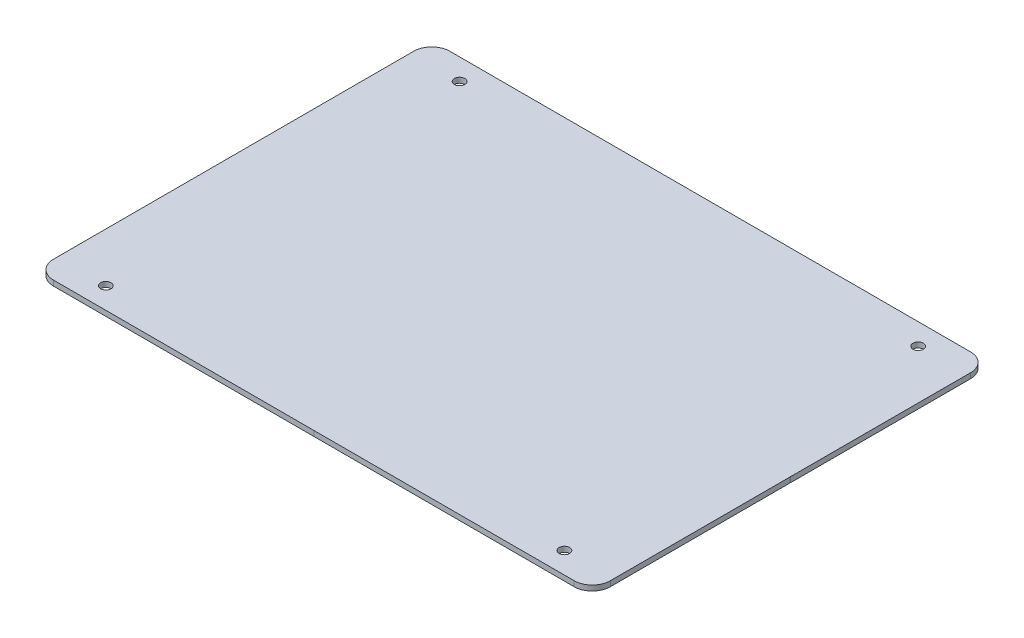
ISO-10303-21;
HEADER;
FILE_DESCRIPTION(('STEP AP214'),'2;1');
FILE_NAME('part.step','',(''),(''),'','','');
FILE_SCHEMA(('AUTOMOTIVE_DESIGN { 1 0 10303 214 1 1 1 1 }'));
ENDSEC;
DATA;
#1=APPLICATION_CONTEXT('core data for automotive mechanical design processes');
#2=APPLICATION_PROTOCOL_DEFINITION('international standard','automotive_design',2000,#1);
#3=PRODUCT_CONTEXT('',#1,'mechanical');
#4=PRODUCT('Part','Part','',(#3));
#5=PRODUCT_RELATED_PRODUCT_CATEGORY('part','',(#4));
#6=PRODUCT_DEFINITION_FORMATION('','',#4);
#7=PRODUCT_DEFINITION_CONTEXT('part definition',#1,'design');
#8=PRODUCT_DEFINITION('design','',#6,#7);
#9=PRODUCT_DEFINITION_SHAPE('','',#8);
#10=(LENGTH_UNIT() NAMED_UNIT(*) SI_UNIT(.MILLI.,.METRE.));
#11=(NAMED_UNIT(*) PLANE_ANGLE_UNIT() SI_UNIT($,.RADIAN.));
#12=(NAMED_UNIT(*) SI_UNIT($,.STERADIAN.) SOLID_ANGLE_UNIT());
#13=UNCERTAINTY_MEASURE_WITH_UNIT(LENGTH_MEASURE(1.E-05),#10,'distance_accuracy_value','');
#14=(GEOMETRIC_REPRESENTATION_CONTEXT(3) GLOBAL_UNCERTAINTY_ASSIGNED_CONTEXT((#13)) GLOBAL_UNIT_ASSIGNED_CONTEXT((#10,
#11,#12)) REPRESENTATION_CONTEXT('',''));
#15=CARTESIAN_POINT('',(0.,0.,0.));
#16=DIRECTION('',(0.,0.,1.));
#17=DIRECTION('',(1.,0.,0.));
#18=AXIS2_PLACEMENT_3D('',#15,#16,#17);
#19=CARTESIAN_POINT('',(-85.0000014499987,1.6,0.));
#20=DIRECTION('',(1.,0.,0.));
#21=DIRECTION('',(0.,0.,-1.));
#22=AXIS2_PLACEMENT_3D('',#19,#20,#21);
#23=PLANE('',#22);
#24=DIRECTION('',(0.,0.,1.));
#25=VECTOR('',#24,1.);
#26=CARTESIAN_POINT('',(-85.0000014499987,0.,0.));
#27=LINE('',#26,#25);
#28=CARTESIAN_POINT('',(-85.0000014499987,0.,-54.9999976960012));
#29=VERTEX_POINT('',#28);
#30=CARTESIAN_POINT('',(-85.0000014499987,0.,54.9999992834999));
#31=VERTEX_POINT('',#30);
#32=EDGE_CURVE('E166',#29,#31,#27,.T.);
#33=ORIENTED_EDGE('',*,*,#32,.T.);
#34=DIRECTION('',(0.,-1.,0.));
#35=VECTOR('',#34,1.);
#36=CARTESIAN_POINT('',(-85.0000014499987,1.6,54.9999992834999));
#37=LINE('',#36,#35);
#38=CARTESIAN_POINT('',(-85.0000014499987,1.6,54.9999992834999));
#39=VERTEX_POINT('',#38);
#40=EDGE_CURVE('E11',#39,#31,#37,.T.);
#41=ORIENTED_EDGE('',*,*,#40,.F.);
#42=DIRECTION('',(0.,0.,1.));
#43=VECTOR('',#42,1.);
#44=CARTESIAN_POINT('',(-85.0000014499987,1.6,0.));
#45=LINE('',#44,#43);
#46=CARTESIAN_POINT('',(-85.0000014499987,1.6,-54.9999976960012));
#47=VERTEX_POINT('',#46);
#48=EDGE_CURVE('E257',#47,#39,#45,.T.);
#49=ORIENTED_EDGE('',*,*,#48,.F.);
#50=DIRECTION('',(0.,-1.,0.));
#51=VECTOR('',#50,1.);
#52=CARTESIAN_POINT('',(-85.0000014499987,1.6,-54.9999976960012));
#53=LINE('',#52,#51);
#54=EDGE_CURVE('E150',#47,#29,#53,.T.);
#55=ORIENTED_EDGE('',*,*,#54,.T.);
#56=EDGE_LOOP('',(#33,#41,#49,#55));
#57=FACE_BOUND('',#56,.T.);
#58=ADVANCED_FACE('F35',(#57),#23,.F.);
#59=CARTESIAN_POINT('',(-79.5000048299987,1.6,54.9999992834999));
#60=DIRECTION('',(0.,-1.,0.));
#61=DIRECTION('',(0.,0.,-1.));
#62=AXIS2_PLACEMENT_3D('',#59,#60,#61);
#63=CYLINDRICAL_SURFACE('',#62,5.49999661999999);
#64=CARTESIAN_POINT('',(-79.5000048299987,0.,54.9999992834999));
#65=DIRECTION('',(0.,1.,0.));
#66=DIRECTION('',(0.,0.,1.));
#67=AXIS2_PLACEMENT_3D('',#64,#65,#66);
#68=CIRCLE('',#67,5.49999661999999);
#69=CARTESIAN_POINT('',(-79.5000054206681,0.,60.4999959034999));
#70=VERTEX_POINT('',#69);
#71=EDGE_CURVE('E169',#31,#70,#68,.T.);
#72=ORIENTED_EDGE('',*,*,#71,.T.);
#73=DIRECTION('',(0.,-1.,0.));
#74=VECTOR('',#73,1.);
#75=CARTESIAN_POINT('',(-79.5000054206681,1.6,60.4999959034999));
#76=LINE('',#75,#74);
#77=CARTESIAN_POINT('',(-79.5000054206681,1.6,60.4999959034999));
#78=VERTEX_POINT('',#77);
#79=EDGE_CURVE('E44',#78,#70,#76,.T.);
#80=ORIENTED_EDGE('',*,*,#79,.F.);
#81=CARTESIAN_POINT('',(-79.5000048299987,1.6,54.9999992834999));
#82=DIRECTION('',(0.,1.,0.));
#83=DIRECTION('',(0.,0.,1.));
#84=AXIS2_PLACEMENT_3D('',#81,#82,#83);
#85=CIRCLE('',#84,5.49999661999999);
#86=EDGE_CURVE('E103',#39,#78,#85,.T.);
#87=ORIENTED_EDGE('',*,*,#86,.F.);
#88=ORIENTED_EDGE('',*,*,#40,.T.);
#89=EDGE_LOOP('',(#72,#80,#87,#88));
#90=FACE_BOUND('',#89,.T.);
#91=ADVANCED_FACE('F272',(#90),#63,.T.);
#92=CARTESIAN_POINT('',(-6.49736788462269E-06,1.6,60.5000044413627));
#93=DIRECTION('',(1.07394502605698E-07,0.,-0.999999999999994));
#94=DIRECTION('',(-0.999999999999994,0.,-1.07394502605698E-07));
#95=AXIS2_PLACEMENT_3D('',#92,#93,#94);
#96=PLANE('',#95);
#97=DIRECTION('',(0.999999999999994,0.,1.07394502605698E-07));
#98=VECTOR('',#97,1.);
#99=CARTESIAN_POINT('',(-6.49736788462269E-06,0.,60.5000044413627));
#100=LINE('',#99,#98);
#101=CARTESIAN_POINT('',(-7.34840897762948E-06,0.,60.5000044413626));
#102=VERTEX_POINT('',#101);
#103=EDGE_CURVE('E171',#70,#102,#100,.T.);
#104=ORIENTED_EDGE('',*,*,#103,.T.);
#105=DIRECTION('',(0.,-1.,0.));
#106=VECTOR('',#105,1.);
#107=CARTESIAN_POINT('',(-7.34840897762948E-06,1.6,60.5000044413626));
#108=LINE('',#107,#106);
#109=CARTESIAN_POINT('',(-7.34840897762948E-06,1.6,60.5000044413626));
#110=VERTEX_POINT('',#109);
#111=EDGE_CURVE('E209',#110,#102,#108,.T.);
#112=ORIENTED_EDGE('',*,*,#111,.F.);
#113=DIRECTION('',(0.999999999999994,0.,1.07394502605698E-07));
#114=VECTOR('',#113,1.);
#115=CARTESIAN_POINT('',(-6.49736788462269E-06,1.6,60.5000044413627));
#116=LINE('',#115,#114);
#117=EDGE_CURVE('E217',#78,#110,#116,.T.);
#118=ORIENTED_EDGE('',*,*,#117,.F.);
#119=ORIENTED_EDGE('',*,*,#79,.T.);
#120=EDGE_LOOP('',(#104,#112,#118,#119));
#121=FACE_BOUND('',#120,.T.);
#122=ADVANCED_FACE('F215',(#121),#96,.F.);
#123=CARTESIAN_POINT('',(5.10036867085493E-06,1.6,60.5000044413616));
#124=DIRECTION('',(-8.43036082054894E-08,0.,-0.999999999999997));
#125=DIRECTION('',(-0.999999999999997,0.,8.43036082054894E-08));
#126=AXIS2_PLACEMENT_3D('',#123,#124,#125);
#127=PLANE('',#126);
#128=DIRECTION('',(0.999999999999996,0.,-8.43036082054894E-08));
#129=VECTOR('',#128,1.);
#130=CARTESIAN_POINT('',(5.10036867085493E-06,0.,60.5000044413616));
#131=LINE('',#130,#129);
#132=CARTESIAN_POINT('',(79.499997673671,0.,60.4999977392253));
#133=VERTEX_POINT('',#132);
#134=EDGE_CURVE('E173',#102,#133,#131,.T.);
#135=ORIENTED_EDGE('',*,*,#134,.T.);
#136=DIRECTION('',(0.,-1.,0.));
#137=VECTOR('',#136,1.);
#138=CARTESIAN_POINT('',(79.499997673671,1.6,60.4999977392253));
#139=LINE('',#138,#137);
#140=CARTESIAN_POINT('',(79.499997673671,1.6,60.4999977392253));
#141=VERTEX_POINT('',#140);
#142=EDGE_CURVE('E206',#141,#133,#139,.T.);
#143=ORIENTED_EDGE('',*,*,#142,.F.);
#144=DIRECTION('',(0.999999999999996,0.,-8.43036082054894E-08));
#145=VECTOR('',#144,1.);
#146=CARTESIAN_POINT('',(5.10036867085493E-06,1.6,60.5000044413616));
#147=LINE('',#146,#145);
#148=EDGE_CURVE('E235',#110,#141,#147,.T.);
#149=ORIENTED_EDGE('',*,*,#148,.F.);
#150=ORIENTED_EDGE('',*,*,#111,.T.);
#151=EDGE_LOOP('',(#135,#143,#149,#150));
#152=FACE_BOUND('',#151,.T.);
#153=ADVANCED_FACE('F225',(#152),#127,.F.);
#154=CARTESIAN_POINT('',(79.4999972100013,1.6,54.9999998492254));
#155=DIRECTION('',(0.,-1.,0.));
#156=DIRECTION('',(0.,0.,-1.));
#157=AXIS2_PLACEMENT_3D('',#154,#155,#156);
#158=CYLINDRICAL_SURFACE('',#157,5.49999788999998);
#159=CARTESIAN_POINT('',(79.4999972100013,0.,54.9999998492254));
#160=DIRECTION('',(0.,1.,0.));
#161=DIRECTION('',(0.,0.,1.));
#162=AXIS2_PLACEMENT_3D('',#159,#160,#161);
#163=CIRCLE('',#162,5.49999788999998);
#164=CARTESIAN_POINT('',(84.9999951000013,0.,54.9999996587254));
#165=VERTEX_POINT('',#164);
#166=EDGE_CURVE('E175',#133,#165,#163,.T.);
#167=ORIENTED_EDGE('',*,*,#166,.T.);
#168=DIRECTION('',(0.,-1.,0.));
#169=VECTOR('',#168,1.);
#170=CARTESIAN_POINT('',(84.9999951000013,1.6,54.9999996587254));
#171=LINE('',#170,#169);
#172=CARTESIAN_POINT('',(84.9999951000013,1.6,54.9999996587254));
#173=VERTEX_POINT('',#172);
#174=EDGE_CURVE('E204',#173,#165,#171,.T.);
#175=ORIENTED_EDGE('',*,*,#174,.F.);
#176=CARTESIAN_POINT('',(79.4999972100013,1.6,54.9999998492254));
#177=DIRECTION('',(0.,1.,0.));
#178=DIRECTION('',(0.,0.,1.));
#179=AXIS2_PLACEMENT_3D('',#176,#177,#178);
#180=CIRCLE('',#179,5.49999788999998);
#181=EDGE_CURVE('E231',#141,#173,#180,.T.);
#182=ORIENTED_EDGE('',*,*,#181,.F.);
#183=ORIENTED_EDGE('',*,*,#142,.T.);
#184=EDGE_LOOP('',(#167,#175,#182,#183));
#185=FACE_BOUND('',#184,.T.);
#186=ADVANCED_FACE('F229',(#185),#158,.T.);
#187=CARTESIAN_POINT('',(84.9999931949999,1.6,-2.94409271226254E-06));
#188=DIRECTION('',(0.999999999999999,0.,-3.4636387623096E-08));
#189=DIRECTION('',(-3.4636387623096E-08,0.,-0.999999999999999));
#190=AXIS2_PLACEMENT_3D('',#187,#188,#189);
#191=PLANE('',#190);
#192=DIRECTION('',(3.4636387623096E-08,0.,1.));
#193=VECTOR('',#192,1.);
#194=CARTESIAN_POINT('',(84.9999931949999,0.,-2.94409271226254E-06));
#195=LINE('',#194,#193);
#196=CARTESIAN_POINT('',(84.9999931971999,0.,0.0635143656241441));
#197=VERTEX_POINT('',#196);
#198=EDGE_CURVE('E178',#197,#165,#195,.T.);
#199=ORIENTED_EDGE('',*,*,#198,.F.);
#200=DIRECTION('',(0.,-1.,0.));
#201=VECTOR('',#200,1.);
#202=CARTESIAN_POINT('',(84.9999931971999,1.6,0.0635143656241441));
#203=LINE('',#202,#201);
#204=CARTESIAN_POINT('',(84.9999931971999,1.6,0.0635143656241441));
#205=VERTEX_POINT('',#204);
#206=EDGE_CURVE('E202',#205,#197,#203,.T.);
#207=ORIENTED_EDGE('',*,*,#206,.F.);
#208=DIRECTION('',(3.4636387623096E-08,0.,1.));
#209=VECTOR('',#208,1.);
#210=CARTESIAN_POINT('',(84.9999931949999,1.6,-2.94409271226254E-06));
#211=LINE('',#210,#209);
#212=EDGE_CURVE('E234',#205,#173,#211,.T.);
#213=ORIENTED_EDGE('',*,*,#212,.T.);
#214=ORIENTED_EDGE('',*,*,#174,.T.);
#215=EDGE_LOOP('',(#199,#207,#213,#214));
#216=FACE_BOUND('',#215,.T.);
#217=ADVANCED_FACE('F382',(#216),#191,.T.);
#218=CARTESIAN_POINT('',(84.9999931950005,1.6,1.43656241365619E-05));
#219=DIRECTION('',(0.,-1.,0.));
#220=DIRECTION('',(0.,0.,-1.));
#221=AXIS2_PLACEMENT_3D('',#218,#219,#220);
#222=CYLINDRICAL_SURFACE('',#221,0.0635000000000076);
#223=CARTESIAN_POINT('',(84.9999931950005,0.,1.43656241365619E-05));
#224=DIRECTION('',(0.,1.,0.));
#225=DIRECTION('',(0.,0.,1.));
#226=AXIS2_PLACEMENT_3D('',#223,#224,#225);
#227=CIRCLE('',#226,0.0635000000000076);
#228=CARTESIAN_POINT('',(84.9999931986661,0.,-0.0634856343758709));
#229=VERTEX_POINT('',#228);
#230=EDGE_CURVE('E181',#229,#197,#227,.T.);
#231=ORIENTED_EDGE('',*,*,#230,.F.);
#232=DIRECTION('',(0.,-1.,0.));
#233=VECTOR('',#232,1.);
#234=CARTESIAN_POINT('',(84.9999931986661,1.6,-0.0634856343758709));
#235=LINE('',#234,#233);
#236=CARTESIAN_POINT('',(84.9999931986661,1.6,-0.0634856343758709));
#237=VERTEX_POINT('',#236);
#238=EDGE_CURVE('E200',#237,#229,#235,.T.);
#239=ORIENTED_EDGE('',*,*,#238,.F.);
#240=CARTESIAN_POINT('',(84.9999931950005,1.6,1.43656241365619E-05));
#241=DIRECTION('',(0.,1.,0.));
#242=DIRECTION('',(0.,0.,1.));
#243=AXIS2_PLACEMENT_3D('',#240,#241,#242);
#244=CIRCLE('',#243,0.0635000000000076);
#245=EDGE_CURVE('E237',#237,#205,#244,.T.);
#246=ORIENTED_EDGE('',*,*,#245,.T.);
#247=ORIENTED_EDGE('',*,*,#206,.T.);
#248=EDGE_LOOP('',(#231,#239,#246,#247));
#249=FACE_BOUND('',#248,.T.);
#250=ADVANCED_FACE('F373',(#249),#222,.F.);
#251=CARTESIAN_POINT('',(84.999993195001,1.6,4.90681595091631E-06));
#252=DIRECTION('',(-0.999999999999998,0.,-5.77272511029434E-08));
#253=DIRECTION('',(-5.77272511029434E-08,0.,0.999999999999998));
#254=AXIS2_PLACEMENT_3D('',#251,#252,#253);
#255=PLANE('',#254);
#256=DIRECTION('',(5.77272511029434E-08,0.,-0.999999999999998));
#257=VECTOR('',#256,1.);
#258=CARTESIAN_POINT('',(84.999993195001,0.,4.90681595091631E-06));
#259=LINE('',#258,#257);
#260=CARTESIAN_POINT('',(84.99999637,0.,-54.9999985272747));
#261=VERTEX_POINT('',#260);
#262=EDGE_CURVE('E184',#229,#261,#259,.T.);
#263=ORIENTED_EDGE('',*,*,#262,.T.);
#264=DIRECTION('',(0.,-1.,0.));
#265=VECTOR('',#264,1.);
#266=CARTESIAN_POINT('',(84.99999637,1.6,-54.9999985272747));
#267=LINE('',#266,#265);
#268=CARTESIAN_POINT('',(84.99999637,1.6,-54.9999985272747));
#269=VERTEX_POINT('',#268);
#270=EDGE_CURVE('E197',#269,#261,#267,.T.);
#271=ORIENTED_EDGE('',*,*,#270,.F.);
#272=DIRECTION('',(5.77272511029434E-08,0.,-0.999999999999998));
#273=VECTOR('',#272,1.);
#274=CARTESIAN_POINT('',(84.999993195001,1.6,4.90681595091631E-06));
#275=LINE('',#274,#273);
#276=EDGE_CURVE('E244',#237,#269,#275,.T.);
#277=ORIENTED_EDGE('',*,*,#276,.F.);
#278=ORIENTED_EDGE('',*,*,#238,.T.);
#279=EDGE_LOOP('',(#263,#271,#277,#278));
#280=FACE_BOUND('',#279,.T.);
#281=ADVANCED_FACE('F249',(#280),#255,.F.);
#282=CARTESIAN_POINT('',(79.49999848,1.6,-54.9999985907743));
#283=DIRECTION('',(0.,-1.,0.));
#284=DIRECTION('',(0.,0.,-1.));
#285=AXIS2_PLACEMENT_3D('',#282,#283,#284);
#286=CYLINDRICAL_SURFACE('',#285,5.49999789);
#287=CARTESIAN_POINT('',(79.49999848,0.,-54.9999985907743));
#288=DIRECTION('',(0.,1.,0.));
#289=DIRECTION('',(0.,0.,1.));
#290=AXIS2_PLACEMENT_3D('',#287,#288,#289);
#291=CIRCLE('',#290,5.49999789);
#292=CARTESIAN_POINT('',(79.4999990706698,0.,-60.4999964807743));
#293=VERTEX_POINT('',#292);
#294=EDGE_CURVE('E186',#261,#293,#291,.T.);
#295=ORIENTED_EDGE('',*,*,#294,.T.);
#296=DIRECTION('',(0.,-1.,0.));
#297=VECTOR('',#296,1.);
#298=CARTESIAN_POINT('',(79.4999990706698,1.6,-60.4999964807743));
#299=LINE('',#298,#297);
#300=CARTESIAN_POINT('',(79.4999990706698,1.6,-60.4999964807743));
#301=VERTEX_POINT('',#300);
#302=EDGE_CURVE('E140',#301,#293,#299,.T.);
#303=ORIENTED_EDGE('',*,*,#302,.F.);
#304=CARTESIAN_POINT('',(79.49999848,1.6,-54.9999985907743));
#305=DIRECTION('',(0.,1.,0.));
#306=DIRECTION('',(0.,0.,1.));
#307=AXIS2_PLACEMENT_3D('',#304,#305,#306);
#308=CIRCLE('',#307,5.49999789);
#309=EDGE_CURVE('E145',#269,#301,#308,.T.);
#310=ORIENTED_EDGE('',*,*,#309,.F.);
#311=ORIENTED_EDGE('',*,*,#270,.T.);
#312=EDGE_LOOP('',(#295,#303,#310,#311));
#313=FACE_BOUND('',#312,.T.);
#314=ADVANCED_FACE('F253',(#313),#286,.T.);
#315=CARTESIAN_POINT('',(6.49736769255435E-06,1.6,-60.5000050186361));
#316=DIRECTION('',(1.07394498406288E-07,0.,-0.999999999999994));
#317=DIRECTION('',(-0.999999999999994,0.,-1.07394498406288E-07));
#318=AXIS2_PLACEMENT_3D('',#315,#316,#317);
#319=PLANE('',#318);
#320=DIRECTION('',(0.999999999999994,0.,1.07394498406288E-07));
#321=VECTOR('',#320,1.);
#322=CARTESIAN_POINT('',(6.49736769255435E-06,0.,-60.5000050186361));
#323=LINE('',#322,#321);
#324=CARTESIAN_POINT('',(0.000129244442129802,0.,-60.5000050186229));
#325=VERTEX_POINT('',#324);
#326=EDGE_CURVE('E135',#325,#293,#323,.T.);
#327=ORIENTED_EDGE('',*,*,#326,.F.);
#328=DIRECTION('',(0.,-1.,0.));
#329=VECTOR('',#328,1.);
#330=CARTESIAN_POINT('',(0.000129244442129802,1.6,-60.5000050186229));
#331=LINE('',#330,#329);
#332=CARTESIAN_POINT('',(0.000129244442129802,1.6,-60.5000050186229));
#333=VERTEX_POINT('',#332);
#334=EDGE_CURVE('E130',#333,#325,#331,.T.);
#335=ORIENTED_EDGE('',*,*,#334,.F.);
#336=DIRECTION('',(0.999999999999994,0.,1.07394498406288E-07));
#337=VECTOR('',#336,1.);
#338=CARTESIAN_POINT('',(6.49736769255435E-06,1.6,-60.5000050186361));
#339=LINE('',#338,#337);
#340=EDGE_CURVE('E133',#333,#301,#339,.T.);
#341=ORIENTED_EDGE('',*,*,#340,.T.);
#342=ORIENTED_EDGE('',*,*,#302,.T.);
#343=EDGE_LOOP('',(#327,#335,#341,#342));
#344=FACE_BOUND('',#343,.T.);
#345=ADVANCED_FACE('F132',(#344),#319,.T.);
#346=CARTESIAN_POINT('',(-5.10034973224451E-06,1.6,-60.5000050186116));
#347=DIRECTION('',(-8.43032943662645E-08,0.,-0.999999999999997));
#348=DIRECTION('',(-0.999999999999997,0.,8.43032943662645E-08));
#349=AXIS2_PLACEMENT_3D('',#346,#347,#348);
#350=PLANE('',#349);
#351=DIRECTION('',(0.999999999999996,0.,-8.43032943662645E-08));
#352=VECTOR('',#351,1.);
#353=CARTESIAN_POINT('',(-5.10034973224451E-06,0.,-60.5000050186116));
#354=LINE('',#353,#352);
#355=CARTESIAN_POINT('',(-79.5000034964998,0.,-60.4999983164998));
#356=VERTEX_POINT('',#355);
#357=EDGE_CURVE('E190',#356,#325,#354,.T.);
#358=ORIENTED_EDGE('',*,*,#357,.F.);
#359=DIRECTION('',(0.,-1.,0.));
#360=VECTOR('',#359,1.);
#361=CARTESIAN_POINT('',(-79.5000034964998,1.6,-60.4999983164998));
#362=LINE('',#361,#360);
#363=CARTESIAN_POINT('',(-79.5000034964998,1.6,-60.4999983164998));
#364=VERTEX_POINT('',#363);
#365=EDGE_CURVE('E92',#364,#356,#362,.T.);
#366=ORIENTED_EDGE('',*,*,#365,.F.);
#367=DIRECTION('',(0.999999999999996,0.,-8.43032943662645E-08));
#368=VECTOR('',#367,1.);
#369=CARTESIAN_POINT('',(-5.10034973224451E-06,1.6,-60.5000050186116));
#370=LINE('',#369,#368);
#371=EDGE_CURVE('E143',#364,#333,#370,.T.);
#372=ORIENTED_EDGE('',*,*,#371,.T.);
#373=ORIENTED_EDGE('',*,*,#334,.T.);
#374=EDGE_LOOP('',(#358,#366,#372,#373));
#375=FACE_BOUND('',#374,.T.);
#376=ADVANCED_FACE('F148',(#375),#350,.T.);
#377=CARTESIAN_POINT('',(-69.9999997,1.6,-54.00000122));
#378=DIRECTION('',(0.,-1.,0.));
#379=DIRECTION('',(0.,0.,-1.));
#380=AXIS2_PLACEMENT_3D('',#377,#378,#379);
#381=CYLINDRICAL_SURFACE('',#380,1.59999934);
#382=CARTESIAN_POINT('',(-69.9999997,1.6,-54.00000122));
#383=DIRECTION('',(0.,1.,0.));
#384=DIRECTION('',(0.,0.,1.));
#385=AXIS2_PLACEMENT_3D('',#382,#383,#384);
#386=CIRCLE('',#385,1.59999934);
#387=CARTESIAN_POINT('',(-69.9999997,1.6,-52.40000188));
#388=VERTEX_POINT('',#387);
#389=EDGE_CURVE('E444',#388,#388,#386,.T.);
#390=ORIENTED_EDGE('',*,*,#389,.T.);
#391=EDGE_LOOP('',(#390));
#392=FACE_BOUND('',#391,.T.);
#393=CARTESIAN_POINT('',(-69.9999997,0.,-54.00000122));
#394=DIRECTION('',(0.,1.,0.));
#395=DIRECTION('',(0.,0.,1.));
#396=AXIS2_PLACEMENT_3D('',#393,#394,#395);
#397=CIRCLE('',#396,1.59999934);
#398=CARTESIAN_POINT('',(-69.9999997,0.,-52.40000188));
#399=VERTEX_POINT('',#398);
#400=EDGE_CURVE('E163',#399,#399,#397,.T.);
#401=ORIENTED_EDGE('',*,*,#400,.F.);
#402=EDGE_LOOP('',(#401));
#403=FACE_BOUND('',#402,.T.);
#404=ADVANCED_FACE('F280',(#392,#403),#381,.F.);
#405=CARTESIAN_POINT('',(69.9999997,1.6,-54.00000122));
#406=DIRECTION('',(0.,-1.,0.));
#407=DIRECTION('',(0.,0.,-1.));
#408=AXIS2_PLACEMENT_3D('',#405,#406,#407);
#409=CYLINDRICAL_SURFACE('',#408,1.59999934000002);
#410=CARTESIAN_POINT('',(69.9999997,1.6,-54.00000122));
#411=DIRECTION('',(0.,1.,0.));
#412=DIRECTION('',(0.,0.,1.));
#413=AXIS2_PLACEMENT_3D('',#410,#411,#412);
#414=CIRCLE('',#413,1.59999934000002);
#415=CARTESIAN_POINT('',(69.9999997,1.6,-52.40000188));
#416=VERTEX_POINT('',#415);
#417=EDGE_CURVE('E441',#416,#416,#414,.T.);
#418=ORIENTED_EDGE('',*,*,#417,.T.);
#419=EDGE_LOOP('',(#418));
#420=FACE_BOUND('',#419,.T.);
#421=CARTESIAN_POINT('',(69.9999997,0.,-54.00000122));
#422=DIRECTION('',(0.,1.,0.));
#423=DIRECTION('',(0.,0.,1.));
#424=AXIS2_PLACEMENT_3D('',#421,#422,#423);
#425=CIRCLE('',#424,1.59999934000002);
#426=CARTESIAN_POINT('',(69.9999997,0.,-52.40000188));
#427=VERTEX_POINT('',#426);
#428=EDGE_CURVE('E160',#427,#427,#425,.T.);
#429=ORIENTED_EDGE('',*,*,#428,.F.);
#430=EDGE_LOOP('',(#429));
#431=FACE_BOUND('',#430,.T.);
#432=ADVANCED_FACE('F283',(#420,#431),#409,.F.);
#433=CARTESIAN_POINT('',(69.9999997,1.6,54.00000122));
#434=DIRECTION('',(0.,-1.,0.));
#435=DIRECTION('',(0.,0.,-1.));
#436=AXIS2_PLACEMENT_3D('',#433,#434,#435);
#437=CYLINDRICAL_SURFACE('',#436,1.59999934000002);
#438=CARTESIAN_POINT('',(69.9999997,1.6,54.00000122));
#439=DIRECTION('',(0.,1.,0.));
#440=DIRECTION('',(0.,0.,1.));
#441=AXIS2_PLACEMENT_3D('',#438,#439,#440);
#442=CIRCLE('',#441,1.59999934000002);
#443=CARTESIAN_POINT('',(69.9999997,1.6,55.60000056));
#444=VERTEX_POINT('',#443);
#445=EDGE_CURVE('E294',#444,#444,#442,.T.);
#446=ORIENTED_EDGE('',*,*,#445,.T.);
#447=EDGE_LOOP('',(#446));
#448=FACE_BOUND('',#447,.T.);
#449=CARTESIAN_POINT('',(69.9999997,0.,54.00000122));
#450=DIRECTION('',(0.,1.,0.));
#451=DIRECTION('',(0.,0.,1.));
#452=AXIS2_PLACEMENT_3D('',#449,#450,#451);
#453=CIRCLE('',#452,1.59999934000002);
#454=CARTESIAN_POINT('',(69.9999997,0.,55.60000056));
#455=VERTEX_POINT('',#454);
#456=EDGE_CURVE('E157',#455,#455,#453,.T.);
#457=ORIENTED_EDGE('',*,*,#456,.F.);
#458=EDGE_LOOP('',(#457));
#459=FACE_BOUND('',#458,.T.);
#460=ADVANCED_FACE('F267',(#448,#459),#437,.F.);
#461=CARTESIAN_POINT('',(-69.9999997,1.6,54.00000122));
#462=DIRECTION('',(0.,-1.,0.));
#463=DIRECTION('',(0.,0.,-1.));
#464=AXIS2_PLACEMENT_3D('',#461,#462,#463);
#465=CYLINDRICAL_SURFACE('',#464,1.59999934);
#466=CARTESIAN_POINT('',(-69.9999997,1.6,54.00000122));
#467=DIRECTION('',(0.,1.,0.));
#468=DIRECTION('',(0.,0.,1.));
#469=AXIS2_PLACEMENT_3D('',#466,#467,#468);
#470=CIRCLE('',#469,1.59999934);
#471=CARTESIAN_POINT('',(-69.9999997,1.6,55.60000056));
#472=VERTEX_POINT('',#471);
#473=EDGE_CURVE('E193',#472,#472,#470,.T.);
#474=ORIENTED_EDGE('',*,*,#473,.T.);
#475=EDGE_LOOP('',(#474));
#476=FACE_BOUND('',#475,.T.);
#477=CARTESIAN_POINT('',(-69.9999997,0.,54.00000122));
#478=DIRECTION('',(0.,1.,0.));
#479=DIRECTION('',(0.,0.,1.));
#480=AXIS2_PLACEMENT_3D('',#477,#478,#479);
#481=CIRCLE('',#480,1.59999934);
#482=CARTESIAN_POINT('',(-69.9999997,0.,55.60000056));
#483=VERTEX_POINT('',#482);
#484=EDGE_CURVE('E154',#483,#483,#481,.T.);
#485=ORIENTED_EDGE('',*,*,#484,.F.);
#486=EDGE_LOOP('',(#485));
#487=FACE_BOUND('',#486,.T.);
#488=ADVANCED_FACE('F37',(#476,#487),#465,.F.);
#489=CARTESIAN_POINT('',(-79.5000035599997,1.6,-55.0000004265001));
#490=DIRECTION('',(0.,-1.,0.));
#491=DIRECTION('',(0.,0.,-1.));
#492=AXIS2_PLACEMENT_3D('',#489,#490,#491);
#493=CYLINDRICAL_SURFACE('',#492,5.49999788999971);
#494=CARTESIAN_POINT('',(-79.5000035599997,0.,-55.0000004265001));
#495=DIRECTION('',(0.,1.,0.));
#496=DIRECTION('',(0.,0.,1.));
#497=AXIS2_PLACEMENT_3D('',#494,#495,#496);
#498=CIRCLE('',#497,5.49999788999971);
#499=EDGE_CURVE('E95',#356,#29,#498,.T.);
#500=ORIENTED_EDGE('',*,*,#499,.T.);
#501=ORIENTED_EDGE('',*,*,#54,.F.);
#502=CARTESIAN_POINT('',(-79.5000035599997,1.6,-55.0000004265001));
#503=DIRECTION('',(0.,1.,0.));
#504=DIRECTION('',(0.,0.,1.));
#505=AXIS2_PLACEMENT_3D('',#502,#503,#504);
#506=CIRCLE('',#505,5.49999788999971);
#507=EDGE_CURVE('E52',#364,#47,#506,.T.);
#508=ORIENTED_EDGE('',*,*,#507,.F.);
#509=ORIENTED_EDGE('',*,*,#365,.T.);
#510=EDGE_LOOP('',(#500,#501,#508,#509));
#511=FACE_BOUND('',#510,.T.);
#512=ADVANCED_FACE('F258',(#511),#493,.T.);
#513=CARTESIAN_POINT('',(0.,1.6,0.));
#514=DIRECTION('',(0.,1.,0.));
#515=DIRECTION('',(0.,0.,1.));
#516=AXIS2_PLACEMENT_3D('',#513,#514,#515);
#517=PLANE('',#516);
#518=ORIENTED_EDGE('',*,*,#473,.F.);
#519=EDGE_LOOP('',(#518));
#520=FACE_BOUND('',#519,.T.);
#521=ORIENTED_EDGE('',*,*,#445,.F.);
#522=EDGE_LOOP('',(#521));
#523=FACE_BOUND('',#522,.T.);
#524=ORIENTED_EDGE('',*,*,#417,.F.);
#525=EDGE_LOOP('',(#524));
#526=FACE_BOUND('',#525,.T.);
#527=ORIENTED_EDGE('',*,*,#389,.F.);
#528=EDGE_LOOP('',(#527));
#529=FACE_BOUND('',#528,.T.);
#530=ORIENTED_EDGE('',*,*,#48,.T.);
#531=ORIENTED_EDGE('',*,*,#86,.T.);
#532=ORIENTED_EDGE('',*,*,#117,.T.);
#533=ORIENTED_EDGE('',*,*,#148,.T.);
#534=ORIENTED_EDGE('',*,*,#181,.T.);
#535=ORIENTED_EDGE('',*,*,#212,.F.);
#536=ORIENTED_EDGE('',*,*,#245,.F.);
#537=ORIENTED_EDGE('',*,*,#276,.T.);
#538=ORIENTED_EDGE('',*,*,#309,.T.);
#539=ORIENTED_EDGE('',*,*,#340,.F.);
#540=ORIENTED_EDGE('',*,*,#371,.F.);
#541=ORIENTED_EDGE('',*,*,#507,.T.);
#542=EDGE_LOOP('',(#530,#531,#532,#533,#534,#535,#536,#537,#538,#539,#540,#541));
#543=FACE_BOUND('',#542,.T.);
#544=ADVANCED_FACE('F142',(#520,#523,#526,#529,#543),#517,.T.);
#545=CARTESIAN_POINT('',(0.,0.,0.));
#546=DIRECTION('',(0.,1.,0.));
#547=DIRECTION('',(0.,0.,1.));
#548=AXIS2_PLACEMENT_3D('',#545,#546,#547);
#549=PLANE('',#548);
#550=ORIENTED_EDGE('',*,*,#484,.T.);
#551=EDGE_LOOP('',(#550));
#552=FACE_BOUND('',#551,.T.);
#553=ORIENTED_EDGE('',*,*,#456,.T.);
#554=EDGE_LOOP('',(#553));
#555=FACE_BOUND('',#554,.T.);
#556=ORIENTED_EDGE('',*,*,#428,.T.);
#557=EDGE_LOOP('',(#556));
#558=FACE_BOUND('',#557,.T.);
#559=ORIENTED_EDGE('',*,*,#400,.T.);
#560=EDGE_LOOP('',(#559));
#561=FACE_BOUND('',#560,.T.);
#562=ORIENTED_EDGE('',*,*,#32,.F.);
#563=ORIENTED_EDGE('',*,*,#499,.F.);
#564=ORIENTED_EDGE('',*,*,#357,.T.);
#565=ORIENTED_EDGE('',*,*,#326,.T.);
#566=ORIENTED_EDGE('',*,*,#294,.F.);
#567=ORIENTED_EDGE('',*,*,#262,.F.);
#568=ORIENTED_EDGE('',*,*,#230,.T.);
#569=ORIENTED_EDGE('',*,*,#198,.T.);
#570=ORIENTED_EDGE('',*,*,#166,.F.);
#571=ORIENTED_EDGE('',*,*,#134,.F.);
#572=ORIENTED_EDGE('',*,*,#103,.F.);
#573=ORIENTED_EDGE('',*,*,#71,.F.);
#574=EDGE_LOOP('',(#562,#563,#564,#565,#566,#567,#568,#569,#570,#571,#572,#573));
#575=FACE_BOUND('',#574,.T.);
#576=ADVANCED_FACE('F221',(#552,#555,#558,#561,#575),#549,.F.);
#577=CLOSED_SHELL('',(#58,#91,#122,#153,#186,#217,#250,#281,#314,#345,#376,#404,#432,#460,#488,
#512,#544,#576));
#578=MANIFOLD_SOLID_BREP('B2',#577);
#579=ADVANCED_BREP_SHAPE_REPRESENTATION('',(#18,#578),#14);
#580=SHAPE_DEFINITION_REPRESENTATION(#9,#579);
ENDSEC;
END-ISO-10303-21;
